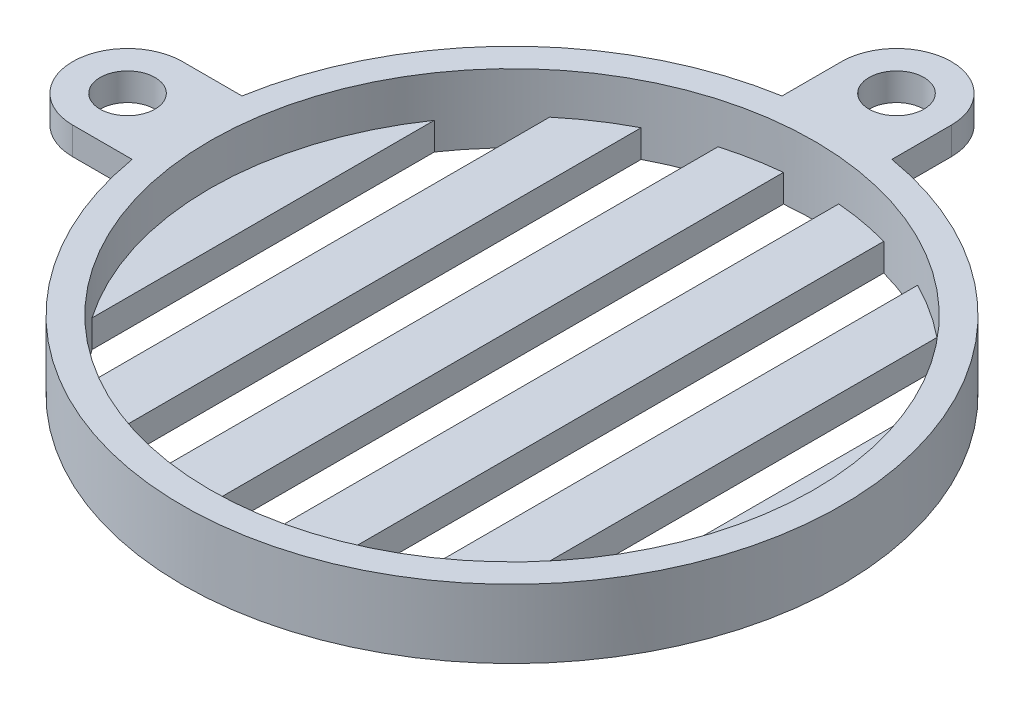
ISO-10303-21;
HEADER;
FILE_DESCRIPTION(('STEP AP214'),'2;1');
FILE_NAME('part.step','',(''),(''),'','','');
FILE_SCHEMA(('AUTOMOTIVE_DESIGN { 1 0 10303 214 1 1 1 1 }'));
ENDSEC;
DATA;
#1=APPLICATION_CONTEXT('core data for automotive mechanical design processes');
#2=APPLICATION_PROTOCOL_DEFINITION('international standard','automotive_design',2000,#1);
#3=PRODUCT_CONTEXT('',#1,'mechanical');
#4=PRODUCT('Part','Part','',(#3));
#5=PRODUCT_RELATED_PRODUCT_CATEGORY('part','',(#4));
#6=PRODUCT_DEFINITION_FORMATION('','',#4);
#7=PRODUCT_DEFINITION_CONTEXT('part definition',#1,'design');
#8=PRODUCT_DEFINITION('design','',#6,#7);
#9=PRODUCT_DEFINITION_SHAPE('','',#8);
#10=(LENGTH_UNIT() NAMED_UNIT(*) SI_UNIT(.MILLI.,.METRE.));
#11=(NAMED_UNIT(*) PLANE_ANGLE_UNIT() SI_UNIT($,.RADIAN.));
#12=(NAMED_UNIT(*) SI_UNIT($,.STERADIAN.) SOLID_ANGLE_UNIT());
#13=UNCERTAINTY_MEASURE_WITH_UNIT(LENGTH_MEASURE(1.E-05),#10,'distance_accuracy_value','');
#14=(GEOMETRIC_REPRESENTATION_CONTEXT(3) GLOBAL_UNCERTAINTY_ASSIGNED_CONTEXT((#13)) GLOBAL_UNIT_ASSIGNED_CONTEXT((#10,
#11,#12)) REPRESENTATION_CONTEXT('',''));
#15=CARTESIAN_POINT('',(0.,0.,0.));
#16=DIRECTION('',(0.,0.,1.));
#17=DIRECTION('',(1.,0.,0.));
#18=AXIS2_PLACEMENT_3D('',#15,#16,#17);
#19=CARTESIAN_POINT('',(0.,5.,0.));
#20=DIRECTION('',(0.,-1.,0.));
#21=DIRECTION('',(0.,0.,-1.));
#22=AXIS2_PLACEMENT_3D('',#19,#20,#21);
#23=CYLINDRICAL_SURFACE('',#22,22.);
#24=DIRECTION('',(0.,-1.,0.));
#25=VECTOR('',#24,1.);
#26=CARTESIAN_POINT('',(17.873171887531,2.,-12.8276937396702));
#27=LINE('',#26,#25);
#28=CARTESIAN_POINT('',(17.873171887531,2.,-12.8276937396702));
#29=VERTEX_POINT('',#28);
#30=CARTESIAN_POINT('',(17.873171887531,0.,-12.8276937396702));
#31=VERTEX_POINT('',#30);
#32=EDGE_CURVE('E309',#29,#31,#27,.T.);
#33=ORIENTED_EDGE('',*,*,#32,.F.);
#34=CARTESIAN_POINT('',(0.,2.,0.));
#35=DIRECTION('',(0.,-1.,0.));
#36=DIRECTION('',(0.,0.,-1.));
#37=AXIS2_PLACEMENT_3D('',#34,#35,#36);
#38=CIRCLE('',#37,22.);
#39=CARTESIAN_POINT('',(17.873171887531,2.,12.8276937396702));
#40=VERTEX_POINT('',#39);
#41=EDGE_CURVE('E302',#40,#29,#38,.F.);
#42=ORIENTED_EDGE('',*,*,#41,.F.);
#43=DIRECTION('',(0.,-1.,0.));
#44=VECTOR('',#43,1.);
#45=CARTESIAN_POINT('',(17.873171887531,2.,12.8276937396702));
#46=LINE('',#45,#44);
#47=CARTESIAN_POINT('',(17.873171887531,0.,12.8276937396702));
#48=VERTEX_POINT('',#47);
#49=EDGE_CURVE('E307',#40,#48,#46,.T.);
#50=ORIENTED_EDGE('',*,*,#49,.T.);
#51=CARTESIAN_POINT('',(0.,0.,0.));
#52=DIRECTION('',(0.,1.,0.));
#53=DIRECTION('',(0.,0.,1.));
#54=AXIS2_PLACEMENT_3D('',#51,#52,#53);
#55=CIRCLE('',#54,22.);
#56=CARTESIAN_POINT('',(13.8731718875309,0.,17.0743990166278));
#57=VERTEX_POINT('',#56);
#58=EDGE_CURVE('E501',#57,#48,#55,.T.);
#59=ORIENTED_EDGE('',*,*,#58,.F.);
#60=DIRECTION('',(0.,-1.,0.));
#61=VECTOR('',#60,1.);
#62=CARTESIAN_POINT('',(13.8731718875309,2.,17.0743990166278));
#63=LINE('',#62,#61);
#64=CARTESIAN_POINT('',(13.8731718875309,2.,17.0743990166278));
#65=VERTEX_POINT('',#64);
#66=EDGE_CURVE('E337',#65,#57,#63,.T.);
#67=ORIENTED_EDGE('',*,*,#66,.F.);
#68=CARTESIAN_POINT('',(0.,2.,0.));
#69=DIRECTION('',(0.,-1.,0.));
#70=DIRECTION('',(0.,0.,-1.));
#71=AXIS2_PLACEMENT_3D('',#68,#69,#70);
#72=CIRCLE('',#71,22.);
#73=CARTESIAN_POINT('',(9.87317188753094,2.,19.660124030109));
#74=VERTEX_POINT('',#73);
#75=EDGE_CURVE('E317',#74,#65,#72,.F.);
#76=ORIENTED_EDGE('',*,*,#75,.F.);
#77=DIRECTION('',(0.,-1.,0.));
#78=VECTOR('',#77,1.);
#79=CARTESIAN_POINT('',(9.87317188753094,2.,19.660124030109));
#80=LINE('',#79,#78);
#81=CARTESIAN_POINT('',(9.87317188753094,0.,19.660124030109));
#82=VERTEX_POINT('',#81);
#83=EDGE_CURVE('E334',#74,#82,#80,.T.);
#84=ORIENTED_EDGE('',*,*,#83,.T.);
#85=CARTESIAN_POINT('',(5.87317188753095,0.,21.2015530558381));
#86=VERTEX_POINT('',#85);
#87=EDGE_CURVE('E503',#86,#82,#55,.T.);
#88=ORIENTED_EDGE('',*,*,#87,.F.);
#89=DIRECTION('',(0.,-1.,0.));
#90=VECTOR('',#89,1.);
#91=CARTESIAN_POINT('',(5.87317188753095,2.,21.2015530558381));
#92=LINE('',#91,#90);
#93=CARTESIAN_POINT('',(5.87317188753095,2.,21.2015530558381));
#94=VERTEX_POINT('',#93);
#95=EDGE_CURVE('E362',#94,#86,#92,.T.);
#96=ORIENTED_EDGE('',*,*,#95,.F.);
#97=CARTESIAN_POINT('',(0.,2.,0.));
#98=DIRECTION('',(0.,-1.,0.));
#99=DIRECTION('',(0.,0.,-1.));
#100=AXIS2_PLACEMENT_3D('',#97,#98,#99);
#101=CIRCLE('',#100,22.);
#102=CARTESIAN_POINT('',(1.87317188753095,2.,21.9201101064699));
#103=VERTEX_POINT('',#102);
#104=EDGE_CURVE('E342',#103,#94,#101,.F.);
#105=ORIENTED_EDGE('',*,*,#104,.F.);
#106=DIRECTION('',(0.,-1.,0.));
#107=VECTOR('',#106,1.);
#108=CARTESIAN_POINT('',(1.87317188753095,2.,21.9201101064699));
#109=LINE('',#108,#107);
#110=CARTESIAN_POINT('',(1.87317188753095,0.,21.9201101064699));
#111=VERTEX_POINT('',#110);
#112=EDGE_CURVE('E359',#103,#111,#109,.T.);
#113=ORIENTED_EDGE('',*,*,#112,.T.);
#114=CARTESIAN_POINT('',(-2.12682811246905,0.,21.8969541758668));
#115=VERTEX_POINT('',#114);
#116=EDGE_CURVE('E506',#115,#111,#55,.T.);
#117=ORIENTED_EDGE('',*,*,#116,.F.);
#118=DIRECTION('',(0.,-1.,0.));
#119=VECTOR('',#118,1.);
#120=CARTESIAN_POINT('',(-2.12682811246905,2.,21.8969541758668));
#121=LINE('',#120,#119);
#122=CARTESIAN_POINT('',(-2.12682811246905,2.,21.8969541758668));
#123=VERTEX_POINT('',#122);
#124=EDGE_CURVE('E387',#123,#115,#121,.T.);
#125=ORIENTED_EDGE('',*,*,#124,.F.);
#126=CARTESIAN_POINT('',(0.,2.,0.));
#127=DIRECTION('',(0.,-1.,0.));
#128=DIRECTION('',(0.,0.,-1.));
#129=AXIS2_PLACEMENT_3D('',#126,#127,#128);
#130=CIRCLE('',#129,22.);
#131=CARTESIAN_POINT('',(-6.12682811246906,2.,21.1296468801601));
#132=VERTEX_POINT('',#131);
#133=EDGE_CURVE('E367',#132,#123,#130,.F.);
#134=ORIENTED_EDGE('',*,*,#133,.F.);
#135=DIRECTION('',(0.,-1.,0.));
#136=VECTOR('',#135,1.);
#137=CARTESIAN_POINT('',(-6.12682811246906,2.,21.1296468801601));
#138=LINE('',#137,#136);
#139=CARTESIAN_POINT('',(-6.12682811246906,0.,21.1296468801601));
#140=VERTEX_POINT('',#139);
#141=EDGE_CURVE('E384',#132,#140,#138,.T.);
#142=ORIENTED_EDGE('',*,*,#141,.T.);
#143=CARTESIAN_POINT('',(-10.1268281124691,0.,19.530677212542));
#144=VERTEX_POINT('',#143);
#145=EDGE_CURVE('E434',#144,#140,#55,.T.);
#146=ORIENTED_EDGE('',*,*,#145,.F.);
#147=DIRECTION('',(0.,-1.,0.));
#148=VECTOR('',#147,1.);
#149=CARTESIAN_POINT('',(-10.1268281124691,2.,19.530677212542));
#150=LINE('',#149,#148);
#151=CARTESIAN_POINT('',(-10.1268281124691,2.,19.530677212542));
#152=VERTEX_POINT('',#151);
#153=EDGE_CURVE('E411',#152,#144,#150,.T.);
#154=ORIENTED_EDGE('',*,*,#153,.F.);
#155=CARTESIAN_POINT('',(0.,2.,0.));
#156=DIRECTION('',(0.,-1.,0.));
#157=DIRECTION('',(0.,0.,-1.));
#158=AXIS2_PLACEMENT_3D('',#155,#156,#157);
#159=CIRCLE('',#158,22.);
#160=CARTESIAN_POINT('',(-14.1268281124691,2.,16.8651334854117));
#161=VERTEX_POINT('',#160);
#162=EDGE_CURVE('E392',#161,#152,#159,.F.);
#163=ORIENTED_EDGE('',*,*,#162,.F.);
#164=DIRECTION('',(0.,-1.,0.));
#165=VECTOR('',#164,1.);
#166=CARTESIAN_POINT('',(-14.1268281124691,2.,16.8651334854117));
#167=LINE('',#166,#165);
#168=CARTESIAN_POINT('',(-14.1268281124691,0.,16.8651334854117));
#169=VERTEX_POINT('',#168);
#170=EDGE_CURVE('E408',#161,#169,#167,.T.);
#171=ORIENTED_EDGE('',*,*,#170,.T.);
#172=CARTESIAN_POINT('',(-18.126828112469,0.,12.4666796935271));
#173=VERTEX_POINT('',#172);
#174=EDGE_CURVE('E431',#173,#169,#55,.T.);
#175=ORIENTED_EDGE('',*,*,#174,.F.);
#176=DIRECTION('',(0.,-1.,0.));
#177=VECTOR('',#176,1.);
#178=CARTESIAN_POINT('',(-18.126828112469,2.,12.4666796935271));
#179=LINE('',#178,#177);
#180=CARTESIAN_POINT('',(-18.126828112469,2.,12.4666796935271));
#181=VERTEX_POINT('',#180);
#182=EDGE_CURVE('E418',#181,#173,#179,.T.);
#183=ORIENTED_EDGE('',*,*,#182,.F.);
#184=CARTESIAN_POINT('',(0.,2.,0.));
#185=DIRECTION('',(0.,-1.,0.));
#186=DIRECTION('',(0.,0.,-1.));
#187=AXIS2_PLACEMENT_3D('',#184,#185,#186);
#188=CIRCLE('',#187,22.);
#189=CARTESIAN_POINT('',(-18.126828112469,2.,-12.4666796935271));
#190=VERTEX_POINT('',#189);
#191=EDGE_CURVE('E416',#190,#181,#188,.F.);
#192=ORIENTED_EDGE('',*,*,#191,.F.);
#193=DIRECTION('',(0.,-1.,0.));
#194=VECTOR('',#193,1.);
#195=CARTESIAN_POINT('',(-18.126828112469,2.,-12.4666796935271));
#196=LINE('',#195,#194);
#197=CARTESIAN_POINT('',(-18.126828112469,0.,-12.4666796935271));
#198=VERTEX_POINT('',#197);
#199=EDGE_CURVE('E421',#190,#198,#196,.T.);
#200=ORIENTED_EDGE('',*,*,#199,.T.);
#201=CARTESIAN_POINT('',(-14.1268281124691,0.,-16.8651334854117));
#202=VERTEX_POINT('',#201);
#203=EDGE_CURVE('E424',#202,#198,#55,.T.);
#204=ORIENTED_EDGE('',*,*,#203,.F.);
#205=DIRECTION('',(0.,-1.,0.));
#206=VECTOR('',#205,1.);
#207=CARTESIAN_POINT('',(-14.1268281124691,2.,-16.8651334854117));
#208=LINE('',#207,#206);
#209=CARTESIAN_POINT('',(-14.1268281124691,2.,-16.8651334854117));
#210=VERTEX_POINT('',#209);
#211=EDGE_CURVE('E405',#210,#202,#208,.T.);
#212=ORIENTED_EDGE('',*,*,#211,.F.);
#213=CARTESIAN_POINT('',(-10.1268281124691,2.,-19.530677212542));
#214=VERTEX_POINT('',#213);
#215=EDGE_CURVE('E396',#214,#210,#159,.F.);
#216=ORIENTED_EDGE('',*,*,#215,.F.);
#217=DIRECTION('',(0.,-1.,0.));
#218=VECTOR('',#217,1.);
#219=CARTESIAN_POINT('',(-10.1268281124691,2.,-19.530677212542));
#220=LINE('',#219,#218);
#221=CARTESIAN_POINT('',(-10.1268281124691,0.,-19.530677212542));
#222=VERTEX_POINT('',#221);
#223=EDGE_CURVE('E401',#214,#222,#220,.T.);
#224=ORIENTED_EDGE('',*,*,#223,.T.);
#225=CARTESIAN_POINT('',(-6.12682811246906,0.,-21.1296468801601));
#226=VERTEX_POINT('',#225);
#227=EDGE_CURVE('E507',#226,#222,#55,.T.);
#228=ORIENTED_EDGE('',*,*,#227,.F.);
#229=DIRECTION('',(0.,-1.,0.));
#230=VECTOR('',#229,1.);
#231=CARTESIAN_POINT('',(-6.12682811246906,2.,-21.1296468801601));
#232=LINE('',#231,#230);
#233=CARTESIAN_POINT('',(-6.12682811246906,2.,-21.1296468801601));
#234=VERTEX_POINT('',#233);
#235=EDGE_CURVE('E381',#234,#226,#232,.T.);
#236=ORIENTED_EDGE('',*,*,#235,.F.);
#237=CARTESIAN_POINT('',(-2.12682811246905,2.,-21.8969541758668));
#238=VERTEX_POINT('',#237);
#239=EDGE_CURVE('E371',#238,#234,#130,.F.);
#240=ORIENTED_EDGE('',*,*,#239,.F.);
#241=DIRECTION('',(0.,-1.,0.));
#242=VECTOR('',#241,1.);
#243=CARTESIAN_POINT('',(-2.12682811246905,2.,-21.8969541758668));
#244=LINE('',#243,#242);
#245=CARTESIAN_POINT('',(-2.12682811246905,0.,-21.8969541758668));
#246=VERTEX_POINT('',#245);
#247=EDGE_CURVE('E377',#238,#246,#244,.T.);
#248=ORIENTED_EDGE('',*,*,#247,.T.);
#249=CARTESIAN_POINT('',(1.87317188753095,0.,-21.9201101064699));
#250=VERTEX_POINT('',#249);
#251=EDGE_CURVE('E504',#250,#246,#55,.T.);
#252=ORIENTED_EDGE('',*,*,#251,.F.);
#253=DIRECTION('',(0.,-1.,0.));
#254=VECTOR('',#253,1.);
#255=CARTESIAN_POINT('',(1.87317188753095,2.,-21.9201101064699));
#256=LINE('',#255,#254);
#257=CARTESIAN_POINT('',(1.87317188753095,2.,-21.9201101064699));
#258=VERTEX_POINT('',#257);
#259=EDGE_CURVE('E356',#258,#250,#256,.T.);
#260=ORIENTED_EDGE('',*,*,#259,.F.);
#261=CARTESIAN_POINT('',(5.87317188753095,2.,-21.2015530558381));
#262=VERTEX_POINT('',#261);
#263=EDGE_CURVE('E346',#262,#258,#101,.F.);
#264=ORIENTED_EDGE('',*,*,#263,.F.);
#265=DIRECTION('',(0.,-1.,0.));
#266=VECTOR('',#265,1.);
#267=CARTESIAN_POINT('',(5.87317188753095,2.,-21.2015530558381));
#268=LINE('',#267,#266);
#269=CARTESIAN_POINT('',(5.87317188753095,0.,-21.2015530558381));
#270=VERTEX_POINT('',#269);
#271=EDGE_CURVE('E352',#262,#270,#268,.T.);
#272=ORIENTED_EDGE('',*,*,#271,.T.);
#273=CARTESIAN_POINT('',(9.87317188753094,0.,-19.660124030109));
#274=VERTEX_POINT('',#273);
#275=EDGE_CURVE('E505',#274,#270,#55,.T.);
#276=ORIENTED_EDGE('',*,*,#275,.F.);
#277=DIRECTION('',(0.,-1.,0.));
#278=VECTOR('',#277,1.);
#279=CARTESIAN_POINT('',(9.87317188753094,2.,-19.660124030109));
#280=LINE('',#279,#278);
#281=CARTESIAN_POINT('',(9.87317188753094,2.,-19.660124030109));
#282=VERTEX_POINT('',#281);
#283=EDGE_CURVE('E331',#282,#274,#280,.T.);
#284=ORIENTED_EDGE('',*,*,#283,.F.);
#285=CARTESIAN_POINT('',(13.8731718875309,2.,-17.0743990166278));
#286=VERTEX_POINT('',#285);
#287=EDGE_CURVE('E321',#286,#282,#72,.F.);
#288=ORIENTED_EDGE('',*,*,#287,.F.);
#289=DIRECTION('',(0.,-1.,0.));
#290=VECTOR('',#289,1.);
#291=CARTESIAN_POINT('',(13.8731718875309,2.,-17.0743990166278));
#292=LINE('',#291,#290);
#293=CARTESIAN_POINT('',(13.8731718875309,0.,-17.0743990166278));
#294=VERTEX_POINT('',#293);
#295=EDGE_CURVE('E327',#286,#294,#292,.T.);
#296=ORIENTED_EDGE('',*,*,#295,.T.);
#297=EDGE_CURVE('E435',#31,#294,#55,.T.);
#298=ORIENTED_EDGE('',*,*,#297,.F.);
#299=EDGE_LOOP('',(#33,#42,#50,#59,#67,#76,#84,#88,#96,#105,#113,#117,#125,#134,#142,#146,#154,
#163,#171,#175,#183,#192,#200,#204,#212,#216,#224,#228,#236,#240,#248,#252,#260,#264,#272,#276,
#284,#288,#296,#298));
#300=FACE_BOUND('',#299,.T.);
#301=CARTESIAN_POINT('',(0.,5.,0.));
#302=DIRECTION('',(0.,1.,0.));
#303=DIRECTION('',(0.,0.,1.));
#304=AXIS2_PLACEMENT_3D('',#301,#302,#303);
#305=CIRCLE('',#304,22.);
#306=CARTESIAN_POINT('',(0.,5.,22.));
#307=VERTEX_POINT('',#306);
#308=EDGE_CURVE('E427',#307,#307,#305,.T.);
#309=ORIENTED_EDGE('',*,*,#308,.T.);
#310=EDGE_LOOP('',(#309));
#311=FACE_BOUND('',#310,.T.);
#312=ADVANCED_FACE('F57',(#300,#311),#23,.F.);
#313=CARTESIAN_POINT('',(0.,5.,0.));
#314=DIRECTION('',(0.,1.,0.));
#315=DIRECTION('',(0.,0.,1.));
#316=AXIS2_PLACEMENT_3D('',#313,#314,#315);
#317=PLANE('',#316);
#318=CARTESIAN_POINT('',(0.,5.,0.));
#319=DIRECTION('',(0.,1.,0.));
#320=DIRECTION('',(0.,0.,1.));
#321=AXIS2_PLACEMENT_3D('',#318,#319,#320);
#322=CIRCLE('',#321,24.);
#323=CARTESIAN_POINT('',(-23.6643191323985,5.,4.));
#324=VERTEX_POINT('',#323);
#325=CARTESIAN_POINT('',(4.00000000000008,5.,-23.6643191323985));
#326=VERTEX_POINT('',#325);
#327=EDGE_CURVE('E248',#324,#326,#322,.T.);
#328=ORIENTED_EDGE('',*,*,#327,.T.);
#329=DIRECTION('',(0.,0.,-1.));
#330=VECTOR('',#329,1.);
#331=CARTESIAN_POINT('',(4.0000000000001,5.,-28.));
#332=LINE('',#331,#330);
#333=CARTESIAN_POINT('',(4.0000000000001,5.,-28.));
#334=VERTEX_POINT('',#333);
#335=EDGE_CURVE('E241',#326,#334,#332,.T.);
#336=ORIENTED_EDGE('',*,*,#335,.T.);
#337=CARTESIAN_POINT('',(0.,5.,-28.));
#338=DIRECTION('',(0.,1.,0.));
#339=DIRECTION('',(0.,0.,1.));
#340=AXIS2_PLACEMENT_3D('',#337,#338,#339);
#341=CIRCLE('',#340,4.);
#342=CARTESIAN_POINT('',(-3.9999999999999,5.,-28.));
#343=VERTEX_POINT('',#342);
#344=EDGE_CURVE('E246',#334,#343,#341,.T.);
#345=ORIENTED_EDGE('',*,*,#344,.T.);
#346=DIRECTION('',(0.,0.,1.));
#347=VECTOR('',#346,1.);
#348=CARTESIAN_POINT('',(-3.99999999999992,5.,-22.8666553667758));
#349=LINE('',#348,#347);
#350=CARTESIAN_POINT('',(-3.99999999999992,5.,-23.6643191323985));
#351=VERTEX_POINT('',#350);
#352=EDGE_CURVE('E72',#343,#351,#349,.T.);
#353=ORIENTED_EDGE('',*,*,#352,.T.);
#354=CARTESIAN_POINT('',(-23.6643191323985,5.,-4.));
#355=VERTEX_POINT('',#354);
#356=EDGE_CURVE('E438',#351,#355,#322,.T.);
#357=ORIENTED_EDGE('',*,*,#356,.T.);
#358=DIRECTION('',(-1.,0.,0.));
#359=VECTOR('',#358,1.);
#360=CARTESIAN_POINT('',(-28.,5.,-4.));
#361=LINE('',#360,#359);
#362=CARTESIAN_POINT('',(-28.,5.,-4.));
#363=VERTEX_POINT('',#362);
#364=EDGE_CURVE('E288',#355,#363,#361,.T.);
#365=ORIENTED_EDGE('',*,*,#364,.T.);
#366=CARTESIAN_POINT('',(-28.,5.,0.));
#367=DIRECTION('',(0.,1.,0.));
#368=DIRECTION('',(0.,0.,1.));
#369=AXIS2_PLACEMENT_3D('',#366,#367,#368);
#370=CIRCLE('',#369,4.);
#371=CARTESIAN_POINT('',(-28.,5.,4.));
#372=VERTEX_POINT('',#371);
#373=EDGE_CURVE('E281',#363,#372,#370,.T.);
#374=ORIENTED_EDGE('',*,*,#373,.T.);
#375=DIRECTION('',(1.,0.,0.));
#376=VECTOR('',#375,1.);
#377=CARTESIAN_POINT('',(-22.8666553667758,5.,4.));
#378=LINE('',#377,#376);
#379=EDGE_CURVE('E79',#372,#324,#378,.T.);
#380=ORIENTED_EDGE('',*,*,#379,.T.);
#381=EDGE_LOOP('',(#328,#336,#345,#353,#357,#365,#374,#380));
#382=FACE_BOUND('',#381,.T.);
#383=ORIENTED_EDGE('',*,*,#308,.F.);
#384=EDGE_LOOP('',(#383));
#385=FACE_BOUND('',#384,.T.);
#386=CARTESIAN_POINT('',(-28.,5.,0.));
#387=DIRECTION('',(0.,1.,0.));
#388=DIRECTION('',(0.,0.,1.));
#389=AXIS2_PLACEMENT_3D('',#386,#387,#388);
#390=CIRCLE('',#389,2.);
#391=CARTESIAN_POINT('',(-28.,5.,2.));
#392=VERTEX_POINT('',#391);
#393=EDGE_CURVE('E276',#392,#392,#390,.T.);
#394=ORIENTED_EDGE('',*,*,#393,.F.);
#395=EDGE_LOOP('',(#394));
#396=FACE_BOUND('',#395,.T.);
#397=CARTESIAN_POINT('',(0.,5.,-28.));
#398=DIRECTION('',(0.,1.,0.));
#399=DIRECTION('',(0.,0.,1.));
#400=AXIS2_PLACEMENT_3D('',#397,#398,#399);
#401=CIRCLE('',#400,2.);
#402=CARTESIAN_POINT('',(0.,5.,-26.));
#403=VERTEX_POINT('',#402);
#404=EDGE_CURVE('E266',#403,#403,#401,.T.);
#405=ORIENTED_EDGE('',*,*,#404,.F.);
#406=EDGE_LOOP('',(#405));
#407=FACE_BOUND('',#406,.T.);
#408=ADVANCED_FACE('F243',(#382,#385,#396,#407),#317,.T.);
#409=CARTESIAN_POINT('',(0.,0.,0.));
#410=DIRECTION('',(0.,1.,0.));
#411=DIRECTION('',(0.,0.,1.));
#412=AXIS2_PLACEMENT_3D('',#409,#410,#411);
#413=PLANE('',#412);
#414=DIRECTION('',(0.,0.,-1.));
#415=VECTOR('',#414,1.);
#416=CARTESIAN_POINT('',(9.87317188753094,0.,0.));
#417=LINE('',#416,#415);
#418=EDGE_CURVE('E318',#82,#274,#417,.T.);
#419=ORIENTED_EDGE('',*,*,#418,.T.);
#420=ORIENTED_EDGE('',*,*,#275,.T.);
#421=DIRECTION('',(0.,0.,-1.));
#422=VECTOR('',#421,1.);
#423=CARTESIAN_POINT('',(5.87317188753095,0.,0.));
#424=LINE('',#423,#422);
#425=EDGE_CURVE('E330',#86,#270,#424,.T.);
#426=ORIENTED_EDGE('',*,*,#425,.F.);
#427=ORIENTED_EDGE('',*,*,#87,.T.);
#428=EDGE_LOOP('',(#419,#420,#426,#427));
#429=FACE_BOUND('',#428,.T.);
#430=DIRECTION('',(0.,0.,-1.));
#431=VECTOR('',#430,1.);
#432=CARTESIAN_POINT('',(1.87317188753095,0.,0.));
#433=LINE('',#432,#431);
#434=EDGE_CURVE('E343',#111,#250,#433,.T.);
#435=ORIENTED_EDGE('',*,*,#434,.T.);
#436=ORIENTED_EDGE('',*,*,#251,.T.);
#437=DIRECTION('',(0.,0.,-1.));
#438=VECTOR('',#437,1.);
#439=CARTESIAN_POINT('',(-2.12682811246905,0.,0.));
#440=LINE('',#439,#438);
#441=EDGE_CURVE('E355',#115,#246,#440,.T.);
#442=ORIENTED_EDGE('',*,*,#441,.F.);
#443=ORIENTED_EDGE('',*,*,#116,.T.);
#444=EDGE_LOOP('',(#435,#436,#442,#443));
#445=FACE_BOUND('',#444,.T.);
#446=DIRECTION('',(0.,0.,-1.));
#447=VECTOR('',#446,1.);
#448=CARTESIAN_POINT('',(-6.12682811246906,0.,0.));
#449=LINE('',#448,#447);
#450=EDGE_CURVE('E368',#140,#226,#449,.T.);
#451=ORIENTED_EDGE('',*,*,#450,.T.);
#452=ORIENTED_EDGE('',*,*,#227,.T.);
#453=DIRECTION('',(0.,0.,-1.));
#454=VECTOR('',#453,1.);
#455=CARTESIAN_POINT('',(-10.1268281124691,0.,0.));
#456=LINE('',#455,#454);
#457=EDGE_CURVE('E380',#144,#222,#456,.T.);
#458=ORIENTED_EDGE('',*,*,#457,.F.);
#459=ORIENTED_EDGE('',*,*,#145,.T.);
#460=EDGE_LOOP('',(#451,#452,#458,#459));
#461=FACE_BOUND('',#460,.T.);
#462=DIRECTION('',(0.,0.,1.));
#463=VECTOR('',#462,1.);
#464=CARTESIAN_POINT('',(-14.1268281124691,0.,0.));
#465=LINE('',#464,#463);
#466=EDGE_CURVE('E393',#202,#169,#465,.T.);
#467=ORIENTED_EDGE('',*,*,#466,.F.);
#468=ORIENTED_EDGE('',*,*,#203,.T.);
#469=DIRECTION('',(0.,0.,-1.));
#470=VECTOR('',#469,1.);
#471=CARTESIAN_POINT('',(-18.126828112469,0.,0.));
#472=LINE('',#471,#470);
#473=EDGE_CURVE('E404',#173,#198,#472,.T.);
#474=ORIENTED_EDGE('',*,*,#473,.F.);
#475=ORIENTED_EDGE('',*,*,#174,.T.);
#476=EDGE_LOOP('',(#467,#468,#474,#475));
#477=FACE_BOUND('',#476,.T.);
#478=CARTESIAN_POINT('',(0.,0.,0.));
#479=DIRECTION('',(0.,1.,0.));
#480=DIRECTION('',(0.,0.,1.));
#481=AXIS2_PLACEMENT_3D('',#478,#479,#480);
#482=CIRCLE('',#481,24.);
#483=CARTESIAN_POINT('',(0.,0.,24.));
#484=VERTEX_POINT('',#483);
#485=EDGE_CURVE('E430',#484,#484,#482,.T.);
#486=ORIENTED_EDGE('',*,*,#485,.F.);
#487=EDGE_LOOP('',(#486));
#488=FACE_BOUND('',#487,.T.);
#489=ORIENTED_EDGE('',*,*,#58,.T.);
#490=DIRECTION('',(0.,0.,-1.));
#491=VECTOR('',#490,1.);
#492=CARTESIAN_POINT('',(17.873171887531,0.,0.));
#493=LINE('',#492,#491);
#494=EDGE_CURVE('E300',#48,#31,#493,.T.);
#495=ORIENTED_EDGE('',*,*,#494,.T.);
#496=ORIENTED_EDGE('',*,*,#297,.T.);
#497=DIRECTION('',(0.,0.,-1.));
#498=VECTOR('',#497,1.);
#499=CARTESIAN_POINT('',(13.8731718875309,0.,0.));
#500=LINE('',#499,#498);
#501=EDGE_CURVE('E312',#57,#294,#500,.T.);
#502=ORIENTED_EDGE('',*,*,#501,.F.);
#503=EDGE_LOOP('',(#489,#495,#496,#502));
#504=FACE_BOUND('',#503,.T.);
#505=ADVANCED_FACE('F477',(#429,#445,#461,#477,#488,#504),#413,.F.);
#506=CARTESIAN_POINT('',(0.,5.,0.));
#507=DIRECTION('',(0.,-1.,0.));
#508=DIRECTION('',(0.,0.,-1.));
#509=AXIS2_PLACEMENT_3D('',#506,#507,#508);
#510=CYLINDRICAL_SURFACE('',#509,24.);
#511=ORIENTED_EDGE('',*,*,#485,.T.);
#512=EDGE_LOOP('',(#511));
#513=FACE_BOUND('',#512,.T.);
#514=CARTESIAN_POINT('',(0.,3.,0.));
#515=DIRECTION('',(0.,1.,0.));
#516=DIRECTION('',(0.,0.,1.));
#517=AXIS2_PLACEMENT_3D('',#514,#515,#516);
#518=CIRCLE('',#517,24.);
#519=CARTESIAN_POINT('',(4.00000000000008,3.,-23.6643191323985));
#520=VERTEX_POINT('',#519);
#521=CARTESIAN_POINT('',(-3.99999999999992,3.,-23.6643191323985));
#522=VERTEX_POINT('',#521);
#523=EDGE_CURVE('E448',#520,#522,#518,.T.);
#524=ORIENTED_EDGE('',*,*,#523,.F.);
#525=DIRECTION('',(0.,-1.,0.));
#526=VECTOR('',#525,1.);
#527=CARTESIAN_POINT('',(4.00000000000008,5.,-23.6643191323985));
#528=LINE('',#527,#526);
#529=EDGE_CURVE('E12',#520,#326,#528,.F.);
#530=ORIENTED_EDGE('',*,*,#529,.T.);
#531=ORIENTED_EDGE('',*,*,#327,.F.);
#532=DIRECTION('',(0.,-1.,0.));
#533=VECTOR('',#532,1.);
#534=CARTESIAN_POINT('',(-23.6643191323985,5.,4.));
#535=LINE('',#534,#533);
#536=CARTESIAN_POINT('',(-23.6643191323985,3.,4.));
#537=VERTEX_POINT('',#536);
#538=EDGE_CURVE('E442',#324,#537,#535,.T.);
#539=ORIENTED_EDGE('',*,*,#538,.T.);
#540=CARTESIAN_POINT('',(0.,3.,0.));
#541=DIRECTION('',(0.,1.,0.));
#542=DIRECTION('',(0.,0.,1.));
#543=AXIS2_PLACEMENT_3D('',#540,#541,#542);
#544=CIRCLE('',#543,24.);
#545=CARTESIAN_POINT('',(-23.6643191323985,3.,-4.));
#546=VERTEX_POINT('',#545);
#547=EDGE_CURVE('E437',#546,#537,#544,.T.);
#548=ORIENTED_EDGE('',*,*,#547,.F.);
#549=DIRECTION('',(0.,-1.,0.));
#550=VECTOR('',#549,1.);
#551=CARTESIAN_POINT('',(-23.6643191323985,5.,-4.));
#552=LINE('',#551,#550);
#553=EDGE_CURVE('E445',#546,#355,#552,.F.);
#554=ORIENTED_EDGE('',*,*,#553,.T.);
#555=ORIENTED_EDGE('',*,*,#356,.F.);
#556=DIRECTION('',(0.,-1.,0.));
#557=VECTOR('',#556,1.);
#558=CARTESIAN_POINT('',(-3.99999999999992,5.,-23.6643191323985));
#559=LINE('',#558,#557);
#560=EDGE_CURVE('E65',#351,#522,#559,.T.);
#561=ORIENTED_EDGE('',*,*,#560,.T.);
#562=EDGE_LOOP('',(#524,#530,#531,#539,#548,#554,#555,#561));
#563=FACE_BOUND('',#562,.T.);
#564=ADVANCED_FACE('F59',(#513,#563),#510,.T.);
#565=CARTESIAN_POINT('',(-18.126828112469,2.,0.));
#566=DIRECTION('',(-1.,0.,0.));
#567=DIRECTION('',(0.,0.,1.));
#568=AXIS2_PLACEMENT_3D('',#565,#566,#567);
#569=PLANE('',#568);
#570=ORIENTED_EDGE('',*,*,#473,.T.);
#571=ORIENTED_EDGE('',*,*,#199,.F.);
#572=DIRECTION('',(0.,0.,-1.));
#573=VECTOR('',#572,1.);
#574=CARTESIAN_POINT('',(-18.126828112469,2.,0.));
#575=LINE('',#574,#573);
#576=EDGE_CURVE('E414',#181,#190,#575,.T.);
#577=ORIENTED_EDGE('',*,*,#576,.F.);
#578=ORIENTED_EDGE('',*,*,#182,.T.);
#579=EDGE_LOOP('',(#570,#571,#577,#578));
#580=FACE_BOUND('',#579,.T.);
#581=ADVANCED_FACE('F482',(#580),#569,.F.);
#582=CARTESIAN_POINT('',(0.,2.,0.));
#583=DIRECTION('',(0.,-1.,0.));
#584=DIRECTION('',(0.,0.,-1.));
#585=AXIS2_PLACEMENT_3D('',#582,#583,#584);
#586=PLANE('',#585);
#587=ORIENTED_EDGE('',*,*,#576,.T.);
#588=ORIENTED_EDGE('',*,*,#191,.T.);
#589=EDGE_LOOP('',(#587,#588));
#590=FACE_BOUND('',#589,.T.);
#591=ADVANCED_FACE('F570',(#590),#586,.F.);
#592=CARTESIAN_POINT('',(-10.1268281124691,2.,0.));
#593=DIRECTION('',(-1.,0.,0.));
#594=DIRECTION('',(0.,0.,1.));
#595=AXIS2_PLACEMENT_3D('',#592,#593,#594);
#596=PLANE('',#595);
#597=ORIENTED_EDGE('',*,*,#457,.T.);
#598=ORIENTED_EDGE('',*,*,#223,.F.);
#599=DIRECTION('',(0.,0.,-1.));
#600=VECTOR('',#599,1.);
#601=CARTESIAN_POINT('',(-10.1268281124691,2.,0.));
#602=LINE('',#601,#600);
#603=EDGE_CURVE('E390',#152,#214,#602,.T.);
#604=ORIENTED_EDGE('',*,*,#603,.F.);
#605=ORIENTED_EDGE('',*,*,#153,.T.);
#606=EDGE_LOOP('',(#597,#598,#604,#605));
#607=FACE_BOUND('',#606,.T.);
#608=ADVANCED_FACE('F531',(#607),#596,.F.);
#609=CARTESIAN_POINT('',(-14.1268281124691,2.,0.));
#610=DIRECTION('',(1.,0.,0.));
#611=DIRECTION('',(0.,0.,-1.));
#612=AXIS2_PLACEMENT_3D('',#609,#610,#611);
#613=PLANE('',#612);
#614=ORIENTED_EDGE('',*,*,#466,.T.);
#615=ORIENTED_EDGE('',*,*,#170,.F.);
#616=DIRECTION('',(0.,0.,1.));
#617=VECTOR('',#616,1.);
#618=CARTESIAN_POINT('',(-14.1268281124691,2.,0.));
#619=LINE('',#618,#617);
#620=EDGE_CURVE('E395',#210,#161,#619,.T.);
#621=ORIENTED_EDGE('',*,*,#620,.F.);
#622=ORIENTED_EDGE('',*,*,#211,.T.);
#623=EDGE_LOOP('',(#614,#615,#621,#622));
#624=FACE_BOUND('',#623,.T.);
#625=ADVANCED_FACE('F543',(#624),#613,.F.);
#626=CARTESIAN_POINT('',(0.,2.,0.));
#627=DIRECTION('',(0.,-1.,0.));
#628=DIRECTION('',(0.,0.,-1.));
#629=AXIS2_PLACEMENT_3D('',#626,#627,#628);
#630=PLANE('',#629);
#631=ORIENTED_EDGE('',*,*,#603,.T.);
#632=ORIENTED_EDGE('',*,*,#215,.T.);
#633=ORIENTED_EDGE('',*,*,#620,.T.);
#634=ORIENTED_EDGE('',*,*,#162,.T.);
#635=EDGE_LOOP('',(#631,#632,#633,#634));
#636=FACE_BOUND('',#635,.T.);
#637=ADVANCED_FACE('F540',(#636),#630,.F.);
#638=CARTESIAN_POINT('',(-2.12682811246905,2.,0.));
#639=DIRECTION('',(-1.,0.,0.));
#640=DIRECTION('',(0.,0.,1.));
#641=AXIS2_PLACEMENT_3D('',#638,#639,#640);
#642=PLANE('',#641);
#643=ORIENTED_EDGE('',*,*,#441,.T.);
#644=ORIENTED_EDGE('',*,*,#247,.F.);
#645=DIRECTION('',(0.,0.,-1.));
#646=VECTOR('',#645,1.);
#647=CARTESIAN_POINT('',(-2.12682811246905,2.,0.));
#648=LINE('',#647,#646);
#649=EDGE_CURVE('E365',#123,#238,#648,.T.);
#650=ORIENTED_EDGE('',*,*,#649,.F.);
#651=ORIENTED_EDGE('',*,*,#124,.T.);
#652=EDGE_LOOP('',(#643,#644,#650,#651));
#653=FACE_BOUND('',#652,.T.);
#654=ADVANCED_FACE('F556',(#653),#642,.F.);
#655=CARTESIAN_POINT('',(-6.12682811246906,2.,0.));
#656=DIRECTION('',(-1.,0.,0.));
#657=DIRECTION('',(0.,0.,1.));
#658=AXIS2_PLACEMENT_3D('',#655,#656,#657);
#659=PLANE('',#658);
#660=ORIENTED_EDGE('',*,*,#450,.F.);
#661=ORIENTED_EDGE('',*,*,#141,.F.);
#662=DIRECTION('',(0.,0.,-1.));
#663=VECTOR('',#662,1.);
#664=CARTESIAN_POINT('',(-6.12682811246906,2.,0.));
#665=LINE('',#664,#663);
#666=EDGE_CURVE('E370',#132,#234,#665,.T.);
#667=ORIENTED_EDGE('',*,*,#666,.T.);
#668=ORIENTED_EDGE('',*,*,#235,.T.);
#669=EDGE_LOOP('',(#660,#661,#667,#668));
#670=FACE_BOUND('',#669,.T.);
#671=ADVANCED_FACE('F549',(#670),#659,.T.);
#672=CARTESIAN_POINT('',(0.,2.,0.));
#673=DIRECTION('',(0.,-1.,0.));
#674=DIRECTION('',(0.,0.,-1.));
#675=AXIS2_PLACEMENT_3D('',#672,#673,#674);
#676=PLANE('',#675);
#677=ORIENTED_EDGE('',*,*,#649,.T.);
#678=ORIENTED_EDGE('',*,*,#239,.T.);
#679=ORIENTED_EDGE('',*,*,#666,.F.);
#680=ORIENTED_EDGE('',*,*,#133,.T.);
#681=EDGE_LOOP('',(#677,#678,#679,#680));
#682=FACE_BOUND('',#681,.T.);
#683=ADVANCED_FACE('F551',(#682),#676,.F.);
#684=CARTESIAN_POINT('',(5.87317188753095,2.,0.));
#685=DIRECTION('',(-1.,0.,0.));
#686=DIRECTION('',(0.,0.,1.));
#687=AXIS2_PLACEMENT_3D('',#684,#685,#686);
#688=PLANE('',#687);
#689=ORIENTED_EDGE('',*,*,#425,.T.);
#690=ORIENTED_EDGE('',*,*,#271,.F.);
#691=DIRECTION('',(0.,0.,-1.));
#692=VECTOR('',#691,1.);
#693=CARTESIAN_POINT('',(5.87317188753095,2.,0.));
#694=LINE('',#693,#692);
#695=EDGE_CURVE('E340',#94,#262,#694,.T.);
#696=ORIENTED_EDGE('',*,*,#695,.F.);
#697=ORIENTED_EDGE('',*,*,#95,.T.);
#698=EDGE_LOOP('',(#689,#690,#696,#697));
#699=FACE_BOUND('',#698,.T.);
#700=ADVANCED_FACE('F512',(#699),#688,.F.);
#701=CARTESIAN_POINT('',(1.87317188753095,2.,0.));
#702=DIRECTION('',(-1.,0.,0.));
#703=DIRECTION('',(0.,0.,1.));
#704=AXIS2_PLACEMENT_3D('',#701,#702,#703);
#705=PLANE('',#704);
#706=ORIENTED_EDGE('',*,*,#434,.F.);
#707=ORIENTED_EDGE('',*,*,#112,.F.);
#708=DIRECTION('',(0.,0.,-1.));
#709=VECTOR('',#708,1.);
#710=CARTESIAN_POINT('',(1.87317188753095,2.,0.));
#711=LINE('',#710,#709);
#712=EDGE_CURVE('E345',#103,#258,#711,.T.);
#713=ORIENTED_EDGE('',*,*,#712,.T.);
#714=ORIENTED_EDGE('',*,*,#259,.T.);
#715=EDGE_LOOP('',(#706,#707,#713,#714));
#716=FACE_BOUND('',#715,.T.);
#717=ADVANCED_FACE('F524',(#716),#705,.T.);
#718=CARTESIAN_POINT('',(0.,2.,0.));
#719=DIRECTION('',(0.,-1.,0.));
#720=DIRECTION('',(0.,0.,-1.));
#721=AXIS2_PLACEMENT_3D('',#718,#719,#720);
#722=PLANE('',#721);
#723=ORIENTED_EDGE('',*,*,#695,.T.);
#724=ORIENTED_EDGE('',*,*,#263,.T.);
#725=ORIENTED_EDGE('',*,*,#712,.F.);
#726=ORIENTED_EDGE('',*,*,#104,.T.);
#727=EDGE_LOOP('',(#723,#724,#725,#726));
#728=FACE_BOUND('',#727,.T.);
#729=ADVANCED_FACE('F521',(#728),#722,.F.);
#730=CARTESIAN_POINT('',(13.8731718875309,2.,0.));
#731=DIRECTION('',(-1.,0.,0.));
#732=DIRECTION('',(0.,0.,1.));
#733=AXIS2_PLACEMENT_3D('',#730,#731,#732);
#734=PLANE('',#733);
#735=ORIENTED_EDGE('',*,*,#501,.T.);
#736=ORIENTED_EDGE('',*,*,#295,.F.);
#737=DIRECTION('',(0.,0.,-1.));
#738=VECTOR('',#737,1.);
#739=CARTESIAN_POINT('',(13.8731718875309,2.,0.));
#740=LINE('',#739,#738);
#741=EDGE_CURVE('E315',#65,#286,#740,.T.);
#742=ORIENTED_EDGE('',*,*,#741,.F.);
#743=ORIENTED_EDGE('',*,*,#66,.T.);
#744=EDGE_LOOP('',(#735,#736,#742,#743));
#745=FACE_BOUND('',#744,.T.);
#746=ADVANCED_FACE('F734',(#745),#734,.F.);
#747=CARTESIAN_POINT('',(9.87317188753094,2.,0.));
#748=DIRECTION('',(-1.,0.,0.));
#749=DIRECTION('',(0.,0.,1.));
#750=AXIS2_PLACEMENT_3D('',#747,#748,#749);
#751=PLANE('',#750);
#752=ORIENTED_EDGE('',*,*,#418,.F.);
#753=ORIENTED_EDGE('',*,*,#83,.F.);
#754=DIRECTION('',(0.,0.,-1.));
#755=VECTOR('',#754,1.);
#756=CARTESIAN_POINT('',(9.87317188753094,2.,0.));
#757=LINE('',#756,#755);
#758=EDGE_CURVE('E320',#74,#282,#757,.T.);
#759=ORIENTED_EDGE('',*,*,#758,.T.);
#760=ORIENTED_EDGE('',*,*,#283,.T.);
#761=EDGE_LOOP('',(#752,#753,#759,#760));
#762=FACE_BOUND('',#761,.T.);
#763=ADVANCED_FACE('F724',(#762),#751,.T.);
#764=CARTESIAN_POINT('',(0.,2.,0.));
#765=DIRECTION('',(0.,-1.,0.));
#766=DIRECTION('',(0.,0.,-1.));
#767=AXIS2_PLACEMENT_3D('',#764,#765,#766);
#768=PLANE('',#767);
#769=ORIENTED_EDGE('',*,*,#741,.T.);
#770=ORIENTED_EDGE('',*,*,#287,.T.);
#771=ORIENTED_EDGE('',*,*,#758,.F.);
#772=ORIENTED_EDGE('',*,*,#75,.T.);
#773=EDGE_LOOP('',(#769,#770,#771,#772));
#774=FACE_BOUND('',#773,.T.);
#775=ADVANCED_FACE('F714',(#774),#768,.F.);
#776=CARTESIAN_POINT('',(17.873171887531,2.,0.));
#777=DIRECTION('',(-1.,0.,0.));
#778=DIRECTION('',(0.,0.,1.));
#779=AXIS2_PLACEMENT_3D('',#776,#777,#778);
#780=PLANE('',#779);
#781=ORIENTED_EDGE('',*,*,#494,.F.);
#782=ORIENTED_EDGE('',*,*,#49,.F.);
#783=DIRECTION('',(0.,0.,-1.));
#784=VECTOR('',#783,1.);
#785=CARTESIAN_POINT('',(17.873171887531,2.,0.));
#786=LINE('',#785,#784);
#787=EDGE_CURVE('E304',#40,#29,#786,.T.);
#788=ORIENTED_EDGE('',*,*,#787,.T.);
#789=ORIENTED_EDGE('',*,*,#32,.T.);
#790=EDGE_LOOP('',(#781,#782,#788,#789));
#791=FACE_BOUND('',#790,.T.);
#792=ADVANCED_FACE('F704',(#791),#780,.T.);
#793=CARTESIAN_POINT('',(0.,2.,0.));
#794=DIRECTION('',(0.,-1.,0.));
#795=DIRECTION('',(0.,0.,-1.));
#796=AXIS2_PLACEMENT_3D('',#793,#794,#795);
#797=PLANE('',#796);
#798=ORIENTED_EDGE('',*,*,#41,.T.);
#799=ORIENTED_EDGE('',*,*,#787,.F.);
#800=EDGE_LOOP('',(#798,#799));
#801=FACE_BOUND('',#800,.T.);
#802=ADVANCED_FACE('F604',(#801),#797,.F.);
#803=CARTESIAN_POINT('',(-28.,3.,-4.));
#804=DIRECTION('',(0.,0.,-1.));
#805=DIRECTION('',(-1.,0.,0.));
#806=AXIS2_PLACEMENT_3D('',#803,#804,#805);
#807=PLANE('',#806);
#808=ORIENTED_EDGE('',*,*,#553,.F.);
#809=DIRECTION('',(-1.,0.,0.));
#810=VECTOR('',#809,1.);
#811=CARTESIAN_POINT('',(-28.,3.,-4.));
#812=LINE('',#811,#810);
#813=CARTESIAN_POINT('',(-28.,3.,-4.));
#814=VERTEX_POINT('',#813);
#815=EDGE_CURVE('E291',#546,#814,#812,.T.);
#816=ORIENTED_EDGE('',*,*,#815,.T.);
#817=DIRECTION('',(0.,1.,0.));
#818=VECTOR('',#817,1.);
#819=CARTESIAN_POINT('',(-28.,3.,-4.));
#820=LINE('',#819,#818);
#821=EDGE_CURVE('E297',#814,#363,#820,.T.);
#822=ORIENTED_EDGE('',*,*,#821,.T.);
#823=ORIENTED_EDGE('',*,*,#364,.F.);
#824=EDGE_LOOP('',(#808,#816,#822,#823));
#825=FACE_BOUND('',#824,.T.);
#826=ADVANCED_FACE('F598',(#825),#807,.T.);
#827=CARTESIAN_POINT('',(-22.8666553667758,3.,4.));
#828=DIRECTION('',(0.,0.,1.));
#829=DIRECTION('',(1.,0.,0.));
#830=AXIS2_PLACEMENT_3D('',#827,#828,#829);
#831=PLANE('',#830);
#832=ORIENTED_EDGE('',*,*,#538,.F.);
#833=ORIENTED_EDGE('',*,*,#379,.F.);
#834=DIRECTION('',(0.,1.,0.));
#835=VECTOR('',#834,1.);
#836=CARTESIAN_POINT('',(-28.,3.,4.));
#837=LINE('',#836,#835);
#838=CARTESIAN_POINT('',(-28.,3.,4.));
#839=VERTEX_POINT('',#838);
#840=EDGE_CURVE('E293',#839,#372,#837,.T.);
#841=ORIENTED_EDGE('',*,*,#840,.F.);
#842=DIRECTION('',(1.,0.,0.));
#843=VECTOR('',#842,1.);
#844=CARTESIAN_POINT('',(-22.8666553667758,3.,4.));
#845=LINE('',#844,#843);
#846=EDGE_CURVE('E287',#839,#537,#845,.T.);
#847=ORIENTED_EDGE('',*,*,#846,.T.);
#848=EDGE_LOOP('',(#832,#833,#841,#847));
#849=FACE_BOUND('',#848,.T.);
#850=ADVANCED_FACE('F603',(#849),#831,.T.);
#851=CARTESIAN_POINT('',(-28.,3.,0.));
#852=DIRECTION('',(0.,1.,0.));
#853=DIRECTION('',(0.,0.,1.));
#854=AXIS2_PLACEMENT_3D('',#851,#852,#853);
#855=CYLINDRICAL_SURFACE('',#854,4.);
#856=ORIENTED_EDGE('',*,*,#373,.F.);
#857=ORIENTED_EDGE('',*,*,#821,.F.);
#858=CARTESIAN_POINT('',(-28.,3.,0.));
#859=DIRECTION('',(0.,1.,0.));
#860=DIRECTION('',(0.,0.,1.));
#861=AXIS2_PLACEMENT_3D('',#858,#859,#860);
#862=CIRCLE('',#861,4.);
#863=EDGE_CURVE('E284',#814,#839,#862,.T.);
#864=ORIENTED_EDGE('',*,*,#863,.T.);
#865=ORIENTED_EDGE('',*,*,#840,.T.);
#866=EDGE_LOOP('',(#856,#857,#864,#865));
#867=FACE_BOUND('',#866,.T.);
#868=ADVANCED_FACE('F615',(#867),#855,.T.);
#869=CARTESIAN_POINT('',(-28.,3.,0.));
#870=DIRECTION('',(0.,1.,0.));
#871=DIRECTION('',(0.,0.,1.));
#872=AXIS2_PLACEMENT_3D('',#869,#870,#871);
#873=PLANE('',#872);
#874=CARTESIAN_POINT('',(-28.,3.,0.));
#875=DIRECTION('',(0.,1.,0.));
#876=DIRECTION('',(0.,0.,1.));
#877=AXIS2_PLACEMENT_3D('',#874,#875,#876);
#878=CIRCLE('',#877,2.);
#879=CARTESIAN_POINT('',(-28.,3.,2.));
#880=VERTEX_POINT('',#879);
#881=EDGE_CURVE('E278',#880,#880,#878,.T.);
#882=ORIENTED_EDGE('',*,*,#881,.T.);
#883=EDGE_LOOP('',(#882));
#884=FACE_BOUND('',#883,.T.);
#885=ORIENTED_EDGE('',*,*,#815,.F.);
#886=ORIENTED_EDGE('',*,*,#547,.T.);
#887=ORIENTED_EDGE('',*,*,#846,.F.);
#888=ORIENTED_EDGE('',*,*,#863,.F.);
#889=EDGE_LOOP('',(#885,#886,#887,#888));
#890=FACE_BOUND('',#889,.T.);
#891=ADVANCED_FACE('F626',(#884,#890),#873,.F.);
#892=CARTESIAN_POINT('',(-28.,3.,0.));
#893=DIRECTION('',(0.,1.,0.));
#894=DIRECTION('',(0.,0.,1.));
#895=AXIS2_PLACEMENT_3D('',#892,#893,#894);
#896=CYLINDRICAL_SURFACE('',#895,2.);
#897=ORIENTED_EDGE('',*,*,#881,.F.);
#898=EDGE_LOOP('',(#897));
#899=FACE_BOUND('',#898,.T.);
#900=ORIENTED_EDGE('',*,*,#393,.T.);
#901=EDGE_LOOP('',(#900));
#902=FACE_BOUND('',#901,.T.);
#903=ADVANCED_FACE('F637',(#899,#902),#896,.F.);
#904=CARTESIAN_POINT('',(4.0000000000001,3.,-28.));
#905=DIRECTION('',(1.,0.,0.));
#906=DIRECTION('',(0.,0.,-1.));
#907=AXIS2_PLACEMENT_3D('',#904,#905,#906);
#908=PLANE('',#907);
#909=ORIENTED_EDGE('',*,*,#529,.F.);
#910=DIRECTION('',(0.,0.,-1.));
#911=VECTOR('',#910,1.);
#912=CARTESIAN_POINT('',(4.0000000000001,3.,-28.));
#913=LINE('',#912,#911);
#914=CARTESIAN_POINT('',(4.0000000000001,3.,-28.));
#915=VERTEX_POINT('',#914);
#916=EDGE_CURVE('E256',#520,#915,#913,.T.);
#917=ORIENTED_EDGE('',*,*,#916,.T.);
#918=DIRECTION('',(0.,1.,0.));
#919=VECTOR('',#918,1.);
#920=CARTESIAN_POINT('',(4.0000000000001,3.,-28.));
#921=LINE('',#920,#919);
#922=EDGE_CURVE('E253',#915,#334,#921,.T.);
#923=ORIENTED_EDGE('',*,*,#922,.T.);
#924=ORIENTED_EDGE('',*,*,#335,.F.);
#925=EDGE_LOOP('',(#909,#917,#923,#924));
#926=FACE_BOUND('',#925,.T.);
#927=ADVANCED_FACE('F254',(#926),#908,.T.);
#928=CARTESIAN_POINT('',(-3.99999999999992,3.,-22.8666553667758));
#929=DIRECTION('',(-1.,0.,0.));
#930=DIRECTION('',(0.,0.,1.));
#931=AXIS2_PLACEMENT_3D('',#928,#929,#930);
#932=PLANE('',#931);
#933=ORIENTED_EDGE('',*,*,#560,.F.);
#934=ORIENTED_EDGE('',*,*,#352,.F.);
#935=DIRECTION('',(0.,1.,0.));
#936=VECTOR('',#935,1.);
#937=CARTESIAN_POINT('',(-3.9999999999999,3.,-28.));
#938=LINE('',#937,#936);
#939=CARTESIAN_POINT('',(-3.9999999999999,3.,-28.));
#940=VERTEX_POINT('',#939);
#941=EDGE_CURVE('E260',#940,#343,#938,.T.);
#942=ORIENTED_EDGE('',*,*,#941,.F.);
#943=DIRECTION('',(0.,0.,1.));
#944=VECTOR('',#943,1.);
#945=CARTESIAN_POINT('',(-3.99999999999992,3.,-22.8666553667758));
#946=LINE('',#945,#944);
#947=EDGE_CURVE('E271',#940,#522,#946,.T.);
#948=ORIENTED_EDGE('',*,*,#947,.T.);
#949=EDGE_LOOP('',(#933,#934,#942,#948));
#950=FACE_BOUND('',#949,.T.);
#951=ADVANCED_FACE('F454',(#950),#932,.T.);
#952=CARTESIAN_POINT('',(0.,3.,-28.));
#953=DIRECTION('',(0.,1.,0.));
#954=DIRECTION('',(0.,0.,1.));
#955=AXIS2_PLACEMENT_3D('',#952,#953,#954);
#956=CYLINDRICAL_SURFACE('',#955,4.);
#957=ORIENTED_EDGE('',*,*,#344,.F.);
#958=ORIENTED_EDGE('',*,*,#922,.F.);
#959=CARTESIAN_POINT('',(0.,3.,-28.));
#960=DIRECTION('',(0.,1.,0.));
#961=DIRECTION('',(0.,0.,1.));
#962=AXIS2_PLACEMENT_3D('',#959,#960,#961);
#963=CIRCLE('',#962,4.);
#964=EDGE_CURVE('E250',#915,#940,#963,.T.);
#965=ORIENTED_EDGE('',*,*,#964,.T.);
#966=ORIENTED_EDGE('',*,*,#941,.T.);
#967=EDGE_LOOP('',(#957,#958,#965,#966));
#968=FACE_BOUND('',#967,.T.);
#969=ADVANCED_FACE('F262',(#968),#956,.T.);
#970=CARTESIAN_POINT('',(0.,3.,-28.));
#971=DIRECTION('',(0.,1.,0.));
#972=DIRECTION('',(0.,0.,1.));
#973=AXIS2_PLACEMENT_3D('',#970,#971,#972);
#974=PLANE('',#973);
#975=CARTESIAN_POINT('',(0.,3.,-28.));
#976=DIRECTION('',(0.,1.,0.));
#977=DIRECTION('',(0.,0.,1.));
#978=AXIS2_PLACEMENT_3D('',#975,#976,#977);
#979=CIRCLE('',#978,2.);
#980=CARTESIAN_POINT('',(0.,3.,-26.));
#981=VERTEX_POINT('',#980);
#982=EDGE_CURVE('E263',#981,#981,#979,.T.);
#983=ORIENTED_EDGE('',*,*,#982,.T.);
#984=EDGE_LOOP('',(#983));
#985=FACE_BOUND('',#984,.T.);
#986=ORIENTED_EDGE('',*,*,#916,.F.);
#987=ORIENTED_EDGE('',*,*,#523,.T.);
#988=ORIENTED_EDGE('',*,*,#947,.F.);
#989=ORIENTED_EDGE('',*,*,#964,.F.);
#990=EDGE_LOOP('',(#986,#987,#988,#989));
#991=FACE_BOUND('',#990,.T.);
#992=ADVANCED_FACE('F457',(#985,#991),#974,.F.);
#993=CARTESIAN_POINT('',(0.,3.,-28.));
#994=DIRECTION('',(0.,1.,0.));
#995=DIRECTION('',(0.,0.,1.));
#996=AXIS2_PLACEMENT_3D('',#993,#994,#995);
#997=CYLINDRICAL_SURFACE('',#996,2.);
#998=ORIENTED_EDGE('',*,*,#982,.F.);
#999=EDGE_LOOP('',(#998));
#1000=FACE_BOUND('',#999,.T.);
#1001=ORIENTED_EDGE('',*,*,#404,.T.);
#1002=EDGE_LOOP('',(#1001));
#1003=FACE_BOUND('',#1002,.T.);
#1004=ADVANCED_FACE('F459',(#1000,#1003),#997,.F.);
#1005=CLOSED_SHELL('',(#312,#408,#505,#564,#581,#591,#608,#625,#637,#654,#671,#683,#700,#717,
#729,#746,#763,#775,#792,#802,#826,#850,#868,#891,#903,#927,#951,#969,#992,#1004));
#1006=MANIFOLD_SOLID_BREP('B2',#1005);
#1007=ADVANCED_BREP_SHAPE_REPRESENTATION('',(#18,#1006),#14);
#1008=SHAPE_DEFINITION_REPRESENTATION(#9,#1007);
ENDSEC;
END-ISO-10303-21;
